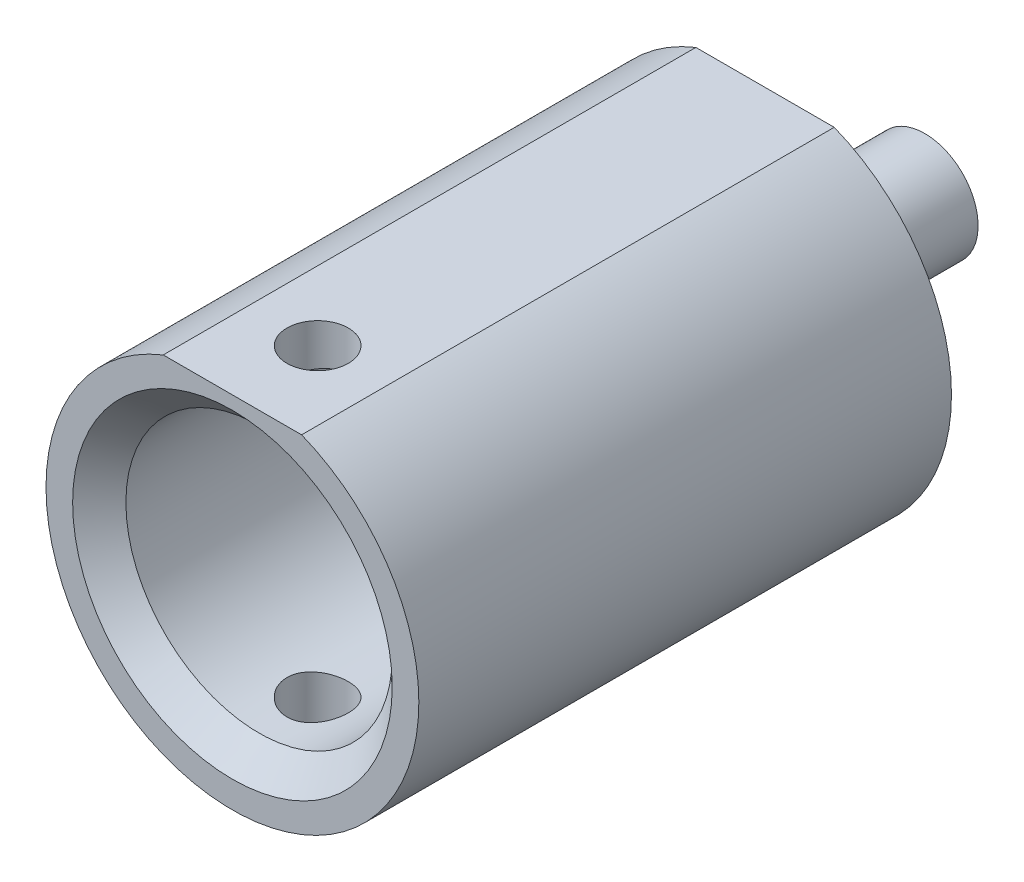
ISO-10303-21;
HEADER;
FILE_DESCRIPTION(('STEP AP214'),'2;1');
FILE_NAME('part.step','',(''),(''),'','','');
FILE_SCHEMA(('AUTOMOTIVE_DESIGN { 1 0 10303 214 1 1 1 1 }'));
ENDSEC;
DATA;
#1=APPLICATION_CONTEXT('core data for automotive mechanical design processes');
#2=APPLICATION_PROTOCOL_DEFINITION('international standard','automotive_design',2000,#1);
#3=PRODUCT_CONTEXT('',#1,'mechanical');
#4=PRODUCT('Part','Part','',(#3));
#5=PRODUCT_RELATED_PRODUCT_CATEGORY('part','',(#4));
#6=PRODUCT_DEFINITION_FORMATION('','',#4);
#7=PRODUCT_DEFINITION_CONTEXT('part definition',#1,'design');
#8=PRODUCT_DEFINITION('design','',#6,#7);
#9=PRODUCT_DEFINITION_SHAPE('','',#8);
#10=(LENGTH_UNIT() NAMED_UNIT(*) SI_UNIT(.MILLI.,.METRE.));
#11=(NAMED_UNIT(*) PLANE_ANGLE_UNIT() SI_UNIT($,.RADIAN.));
#12=(NAMED_UNIT(*) SI_UNIT($,.STERADIAN.) SOLID_ANGLE_UNIT());
#13=UNCERTAINTY_MEASURE_WITH_UNIT(LENGTH_MEASURE(1.E-05),#10,'distance_accuracy_value','');
#14=(GEOMETRIC_REPRESENTATION_CONTEXT(3) GLOBAL_UNCERTAINTY_ASSIGNED_CONTEXT((#13)) GLOBAL_UNIT_ASSIGNED_CONTEXT((#10,
#11,#12)) REPRESENTATION_CONTEXT('',''));
#15=CARTESIAN_POINT('',(0.,0.,0.));
#16=DIRECTION('',(0.,0.,1.));
#17=DIRECTION('',(1.,0.,0.));
#18=AXIS2_PLACEMENT_3D('',#15,#16,#17);
#19=CARTESIAN_POINT('',(-11.1125,10.31875,-31.75));
#20=DIRECTION('',(0.,-1.,0.));
#21=DIRECTION('',(0.,0.,-1.));
#22=AXIS2_PLACEMENT_3D('',#19,#20,#21);
#23=PLANE('',#22);
#24=DIRECTION('',(1.,0.,0.));
#25=VECTOR('',#24,1.);
#26=CARTESIAN_POINT('',(-11.1125,10.31875,0.));
#27=LINE('',#26,#25);
#28=CARTESIAN_POINT('',(-4.12444598552339,10.31875,0.));
#29=VERTEX_POINT('',#28);
#30=CARTESIAN_POINT('',(4.12444598552339,10.31875,0.));
#31=VERTEX_POINT('',#30);
#32=EDGE_CURVE('E167',#29,#31,#27,.T.);
#33=ORIENTED_EDGE('',*,*,#32,.T.);
#34=DIRECTION('',(0.,0.,-1.));
#35=VECTOR('',#34,1.);
#36=CARTESIAN_POINT('',(4.12444598552338,10.31875,-25.4));
#37=LINE('',#36,#35);
#38=CARTESIAN_POINT('',(4.12444598552338,10.31875,-31.75));
#39=VERTEX_POINT('',#38);
#40=EDGE_CURVE('E57',#39,#31,#37,.F.);
#41=ORIENTED_EDGE('',*,*,#40,.F.);
#42=DIRECTION('',(1.,0.,0.));
#43=VECTOR('',#42,1.);
#44=CARTESIAN_POINT('',(11.1125,10.31875,-31.75));
#45=LINE('',#44,#43);
#46=CARTESIAN_POINT('',(-4.12444598552339,10.31875,-31.75));
#47=VERTEX_POINT('',#46);
#48=EDGE_CURVE('E68',#47,#39,#45,.T.);
#49=ORIENTED_EDGE('',*,*,#48,.F.);
#50=DIRECTION('',(0.,0.,-1.));
#51=VECTOR('',#50,1.);
#52=CARTESIAN_POINT('',(-4.12444598552339,10.31875,-25.4));
#53=LINE('',#52,#51);
#54=EDGE_CURVE('E71',#29,#47,#53,.T.);
#55=ORIENTED_EDGE('',*,*,#54,.F.);
#56=EDGE_LOOP('',(#33,#41,#49,#55));
#57=FACE_BOUND('',#56,.T.);
#58=CARTESIAN_POINT('',(0.,10.31875,-5.08));
#59=DIRECTION('',(0.,1.,0.));
#60=DIRECTION('',(0.,0.,1.));
#61=AXIS2_PLACEMENT_3D('',#58,#59,#60);
#62=CIRCLE('',#61,1.8288);
#63=CARTESIAN_POINT('',(0.,10.31875,-3.2512));
#64=VERTEX_POINT('',#63);
#65=EDGE_CURVE('E129',#64,#64,#62,.T.);
#66=ORIENTED_EDGE('',*,*,#65,.F.);
#67=EDGE_LOOP('',(#66));
#68=FACE_BOUND('',#67,.T.);
#69=ADVANCED_FACE('F40',(#57,#68),#23,.F.);
#70=CARTESIAN_POINT('',(7.9375,0.,0.));
#71=DIRECTION('',(0.,0.,-1.));
#72=DIRECTION('',(-1.,0.,0.));
#73=AXIS2_PLACEMENT_3D('',#70,#71,#72);
#74=PLANE('',#73);
#75=CARTESIAN_POINT('',(0.,0.,0.));
#76=DIRECTION('',(0.,0.,-1.));
#77=DIRECTION('',(-1.,0.,0.));
#78=AXIS2_PLACEMENT_3D('',#75,#76,#77);
#79=CIRCLE('',#78,9.52500000000001);
#80=CARTESIAN_POINT('',(-9.52500000000001,0.,0.));
#81=VERTEX_POINT('',#80);
#82=EDGE_CURVE('E11',#81,#81,#79,.T.);
#83=ORIENTED_EDGE('',*,*,#82,.T.);
#84=EDGE_LOOP('',(#83));
#85=FACE_BOUND('',#84,.T.);
#86=CARTESIAN_POINT('',(0.,0.,0.));
#87=DIRECTION('',(0.,0.,-1.));
#88=DIRECTION('',(-1.,0.,0.));
#89=AXIS2_PLACEMENT_3D('',#86,#87,#88);
#90=CIRCLE('',#89,11.1125);
#91=EDGE_CURVE('E78',#31,#29,#90,.T.);
#92=ORIENTED_EDGE('',*,*,#91,.F.);
#93=ORIENTED_EDGE('',*,*,#32,.F.);
#94=EDGE_LOOP('',(#92,#93));
#95=FACE_BOUND('',#94,.T.);
#96=ADVANCED_FACE('F154',(#85,#95),#74,.F.);
#97=CARTESIAN_POINT('',(0.,0.,-25.4));
#98=DIRECTION('',(0.,0.,-1.));
#99=DIRECTION('',(-1.,0.,0.));
#100=AXIS2_PLACEMENT_3D('',#97,#98,#99);
#101=CYLINDRICAL_SURFACE('',#100,11.1125);
#102=CARTESIAN_POINT('',(0.,-11.1125,-3.2512));
#103=CARTESIAN_POINT('',(0.101985960535653,-11.1124982653038,-3.25120410548556));
#104=CARTESIAN_POINT('',(0.204028043247026,-11.1110813861697,-3.25975993185678));
#105=CARTESIAN_POINT('',(0.405251523738962,-11.1055656033744,-3.29374368015818));
#106=CARTESIAN_POINT('',(0.504430181648661,-11.1014642144057,-3.31918723698266));
#107=CARTESIAN_POINT('',(0.69698629945415,-11.0910395524147,-3.38615848071108));
#108=CARTESIAN_POINT('',(0.790368386776859,-11.0847180792523,-3.42767314127914));
#109=CARTESIAN_POINT('',(0.968829151098192,-11.0705487668123,-3.525574329719));
#110=CARTESIAN_POINT('',(1.05390880270725,-11.062701107016,-3.58195910912582));
#111=CARTESIAN_POINT('',(1.21415570768047,-11.046267864757,-3.70855977981771));
#112=CARTESIAN_POINT('',(1.2892342504777,-11.0376766672591,-3.7788872410582));
#113=CARTESIAN_POINT('',(1.42658156525565,-11.020767735379,-3.93113679679186));
#114=CARTESIAN_POINT('',(1.48884953833928,-11.012450018079,-4.01305961386112));
#115=CARTESIAN_POINT('',(1.59916234075337,-10.9969754147448,-4.18678203635041));
#116=CARTESIAN_POINT('',(1.64711969481333,-10.989825784274,-4.27863789075198));
#117=CARTESIAN_POINT('',(1.72689058351035,-10.9775746002825,-4.46923874282233));
#118=CARTESIAN_POINT('',(1.75870518068841,-10.9724729119676,-4.56798328658024));
#119=CARTESIAN_POINT('',(1.80500847544525,-10.9649510462,-4.76861911753284));
#120=CARTESIAN_POINT('',(1.8196501607605,-10.9625072053294,-4.87047419395057));
#121=CARTESIAN_POINT('',(1.83166629505133,-10.960506117847,-5.07522251696541));
#122=CARTESIAN_POINT('',(1.82904193558186,-10.9609486720408,-5.17811569143255));
#123=CARTESIAN_POINT('',(1.80672514342344,-10.9646487623503,-5.38092883999761));
#124=CARTESIAN_POINT('',(1.78720437748207,-10.9678779850454,-5.48086829528332));
#125=CARTESIAN_POINT('',(1.73191821058887,-10.9767432517669,-5.67603389159448));
#126=CARTESIAN_POINT('',(1.69615226520577,-10.9823793764565,-5.77125987453679));
#127=CARTESIAN_POINT('',(1.60921636854674,-10.995454073291,-5.95481042632173));
#128=CARTESIAN_POINT('',(1.55797494509279,-11.0029009765789,-6.04310052563737));
#129=CARTESIAN_POINT('',(1.44159341321552,-11.0187523371249,-6.20989432005747));
#130=CARTESIAN_POINT('',(1.37645221043961,-11.0271568697544,-6.28839724382999));
#131=CARTESIAN_POINT('',(1.23318399862092,-11.0441010081602,-6.43438212626586));
#132=CARTESIAN_POINT('',(1.15490966156367,-11.0526410193835,-6.50171953530278));
#133=CARTESIAN_POINT('',(0.988095880112558,-11.068799988199,-6.62232584362568));
#134=CARTESIAN_POINT('',(0.899556372612236,-11.0764189401284,-6.67559465641654));
#135=CARTESIAN_POINT('',(0.714591042791295,-11.0898877687047,-6.76656406709567));
#136=CARTESIAN_POINT('',(0.618158934188807,-11.0957362174189,-6.80425210780656));
#137=CARTESIAN_POINT('',(0.420216068834705,-11.1049935533848,-6.86285711681494));
#138=CARTESIAN_POINT('',(0.318705726912424,-11.1084026395554,-6.8837754526226));
#139=CARTESIAN_POINT('',(0.114734004545082,-11.1123704433878,-6.90805179365634));
#140=CARTESIAN_POINT('',(0.0122968508158143,-11.1129613754213,-6.91160827374304));
#141=CARTESIAN_POINT('',(-0.191709829817353,-11.1113144504187,-6.90158878404296));
#142=CARTESIAN_POINT('',(-0.293279389098974,-11.1090766994144,-6.88801345643453));
#143=CARTESIAN_POINT('',(-0.492056200577945,-11.102043787206,-6.84428078060995));
#144=CARTESIAN_POINT('',(-0.589285607361028,-11.0972637539347,-6.81422148821793));
#145=CARTESIAN_POINT('',(-0.777324902870263,-11.0856801606181,-6.73847853882407));
#146=CARTESIAN_POINT('',(-0.868134438285147,-11.078876489311,-6.69279402270996));
#147=CARTESIAN_POINT('',(-1.04161974352678,-11.0639206396394,-6.58664142170487));
#148=CARTESIAN_POINT('',(-1.12421852036903,-11.0557573258866,-6.52604910602645));
#149=CARTESIAN_POINT('',(-1.27814635489314,-11.0390218767154,-6.39197206254774));
#150=CARTESIAN_POINT('',(-1.34947461501104,-11.0304497124204,-6.31848642312058));
#151=CARTESIAN_POINT('',(-1.47957060227745,-11.0137587973787,-6.15981941384805));
#152=CARTESIAN_POINT('',(-1.53820436630089,-11.0056454927491,-6.0745275406457));
#153=CARTESIAN_POINT('',(-1.64031195080058,-10.9908919400377,-5.89518839893954));
#154=CARTESIAN_POINT('',(-1.68378624303428,-10.9842516461185,-5.80114140300751));
#155=CARTESIAN_POINT('',(-1.7541394962161,-10.9732366337449,-5.60733949652736));
#156=CARTESIAN_POINT('',(-1.78108563681604,-10.9688527558105,-5.50760951733691));
#157=CARTESIAN_POINT('',(-1.8178294169093,-10.9628237752277,-5.30496093587188));
#158=CARTESIAN_POINT('',(-1.82762850642928,-10.9611784409971,-5.20204260396694));
#159=CARTESIAN_POINT('',(-1.82976036186447,-10.9608226469247,-4.99727617260834));
#160=CARTESIAN_POINT('',(-1.82230396017862,-10.9620767606391,-4.89543026813602));
#161=CARTESIAN_POINT('',(-1.79059184583152,-10.9673009987978,-4.69446302701059));
#162=CARTESIAN_POINT('',(-1.76633618374101,-10.9712711150662,-4.59534168215667));
#163=CARTESIAN_POINT('',(-1.70179404198128,-10.9814667041126,-4.40271576019903));
#164=CARTESIAN_POINT('',(-1.66152526851135,-10.9876896851486,-4.30920511017189));
#165=CARTESIAN_POINT('',(-1.56612154810081,-11.0016923216277,-4.13023283417337));
#166=CARTESIAN_POINT('',(-1.51098589411298,-11.0094720511029,-4.04477159128099));
#167=CARTESIAN_POINT('',(-1.38665928330937,-11.0258241278221,-3.88325807729798));
#168=CARTESIAN_POINT('',(-1.31731307785735,-11.0344046046771,-3.80732611674653));
#169=CARTESIAN_POINT('',(-1.16686135502921,-11.0513261367212,-3.66810405791292));
#170=CARTESIAN_POINT('',(-1.08575312548285,-11.0596671361572,-3.60481688337937));
#171=CARTESIAN_POINT('',(-0.913432962190398,-11.0752347211619,-3.49229342623428));
#172=CARTESIAN_POINT('',(-0.822156822293083,-11.0824534450163,-3.44315437723751));
#173=CARTESIAN_POINT('',(-0.632564875730705,-11.0948865635832,-3.36098171401747));
#174=CARTESIAN_POINT('',(-0.534256230784516,-11.1001029638852,-3.32793197529191));
#175=CARTESIAN_POINT('',(-0.362964683690035,-11.1067984499267,-3.28609228113667));
#176=CARTESIAN_POINT('',(-0.291020897467136,-11.108925161963,-3.27302850448139));
#177=CARTESIAN_POINT('',(-0.146060992144094,-11.1117765466226,-3.25558096546249));
#178=CARTESIAN_POINT('',(-0.0730448907983154,-11.1125012424327,-3.25119705954876));
#179=CARTESIAN_POINT('',(0.,-11.1125,-3.2512));
#180=B_SPLINE_CURVE_WITH_KNOTS('',3,(#102,#103,#104,#105,#106,#107,#108,#109,#110,#111,#112,
#113,#114,#115,#116,#117,#118,#119,#120,#121,#122,#123,#124,#125,#126,#127,#128,#129,#130,#131,
#132,#133,#134,#135,#136,#137,#138,#139,#140,#141,#142,#143,#144,#145,#146,#147,#148,#149,#150,
#151,#152,#153,#154,#155,#156,#157,#158,#159,#160,#161,#162,#163,#164,#165,#166,#167,#168,#169,
#170,#171,#172,#173,#174,#175,#176,#177,#178,#179),.UNSPECIFIED.,.T.,.F.,(4,2,2,2,2,2,2,2,2,2,2,
2,2,2,2,2,2,2,2,2,2,2,2,2,2,2,2,2,2,2,2,2,2,2,2,2,2,2,4),(0.,0.305690892734799,
0.611665193824152,0.917392006819801,1.22308288772342,1.53132655924921,1.83958944774879,
2.14969974648115,2.45978963062957,2.7670955239289,3.07438020982243,3.37857906193167,
3.6827881095324,3.98842418225694,4.29408432709893,4.60343591699062,4.91278940876195,
5.22239173731312,5.53196881631981,5.83799849160388,6.14401669583946,6.44823397425175,
6.75246798194876,7.05932863847077,7.36621100043049,7.67618905032028,7.98615745294054,
8.29485747421136,8.60353138925,8.90845378507457,9.21337526299625,9.51796051304439,
9.82256025128012,10.1306844351916,10.4388797818527,10.7491452430969,11.05909911682,
11.2780461861578,11.4969896344577),.UNSPECIFIED.);
#181=CARTESIAN_POINT('',(0.,-11.1125,-3.2512));
#182=VERTEX_POINT('',#181);
#183=EDGE_CURVE('E77',#182,#182,#180,.T.);
#184=ORIENTED_EDGE('',*,*,#183,.T.);
#185=EDGE_LOOP('',(#184));
#186=FACE_BOUND('',#185,.T.);
#187=ORIENTED_EDGE('',*,*,#91,.T.);
#188=ORIENTED_EDGE('',*,*,#54,.T.);
#189=CARTESIAN_POINT('',(0.,0.,-31.75));
#190=DIRECTION('',(0.,0.,-1.));
#191=DIRECTION('',(-1.,0.,0.));
#192=AXIS2_PLACEMENT_3D('',#189,#190,#191);
#193=CIRCLE('',#192,11.1125);
#194=EDGE_CURVE('E83',#39,#47,#193,.T.);
#195=ORIENTED_EDGE('',*,*,#194,.F.);
#196=ORIENTED_EDGE('',*,*,#40,.T.);
#197=EDGE_LOOP('',(#187,#188,#195,#196));
#198=FACE_BOUND('',#197,.T.);
#199=ADVANCED_FACE('F82',(#186,#198),#101,.T.);
#200=CARTESIAN_POINT('',(11.1125,0.,-31.75));
#201=DIRECTION('',(0.,0.,1.));
#202=DIRECTION('',(1.,0.,0.));
#203=AXIS2_PLACEMENT_3D('',#200,#201,#202);
#204=PLANE('',#203);
#205=CARTESIAN_POINT('',(0.,0.,-31.75));
#206=DIRECTION('',(0.,0.,-1.));
#207=DIRECTION('',(-1.,0.,0.));
#208=AXIS2_PLACEMENT_3D('',#205,#206,#207);
#209=CIRCLE('',#208,3.175);
#210=CARTESIAN_POINT('',(-3.175,0.,-31.75));
#211=VERTEX_POINT('',#210);
#212=EDGE_CURVE('E90',#211,#211,#209,.T.);
#213=ORIENTED_EDGE('',*,*,#212,.F.);
#214=EDGE_LOOP('',(#213));
#215=FACE_BOUND('',#214,.T.);
#216=ORIENTED_EDGE('',*,*,#194,.T.);
#217=ORIENTED_EDGE('',*,*,#48,.T.);
#218=EDGE_LOOP('',(#216,#217));
#219=FACE_BOUND('',#218,.T.);
#220=ADVANCED_FACE('F88',(#215,#219),#204,.F.);
#221=CARTESIAN_POINT('',(0.,0.,-25.4));
#222=DIRECTION('',(0.,0.,-1.));
#223=DIRECTION('',(-1.,0.,0.));
#224=AXIS2_PLACEMENT_3D('',#221,#222,#223);
#225=CYLINDRICAL_SURFACE('',#224,3.175);
#226=CARTESIAN_POINT('',(0.,0.,-41.275));
#227=DIRECTION('',(0.,0.,-1.));
#228=DIRECTION('',(-1.,0.,0.));
#229=AXIS2_PLACEMENT_3D('',#226,#227,#228);
#230=CIRCLE('',#229,3.175);
#231=CARTESIAN_POINT('',(-3.175,0.,-41.275));
#232=VERTEX_POINT('',#231);
#233=EDGE_CURVE('E96',#232,#232,#230,.T.);
#234=ORIENTED_EDGE('',*,*,#233,.F.);
#235=EDGE_LOOP('',(#234));
#236=FACE_BOUND('',#235,.T.);
#237=ORIENTED_EDGE('',*,*,#212,.T.);
#238=EDGE_LOOP('',(#237));
#239=FACE_BOUND('',#238,.T.);
#240=ADVANCED_FACE('F145',(#236,#239),#225,.T.);
#241=CARTESIAN_POINT('',(3.175,0.,-41.275));
#242=DIRECTION('',(0.,0.,1.));
#243=DIRECTION('',(1.,0.,0.));
#244=AXIS2_PLACEMENT_3D('',#241,#242,#243);
#245=PLANE('',#244);
#246=ORIENTED_EDGE('',*,*,#233,.T.);
#247=EDGE_LOOP('',(#246));
#248=FACE_BOUND('',#247,.T.);
#249=ADVANCED_FACE('F142',(#248),#245,.F.);
#250=CARTESIAN_POINT('',(0.,0.,-25.4));
#251=DIRECTION('',(0.,0.,1.));
#252=DIRECTION('',(1.,0.,0.));
#253=AXIS2_PLACEMENT_3D('',#250,#251,#252);
#254=CONICAL_SURFACE('',#253,7.9375,1.02974425867665);
#255=CARTESIAN_POINT('',(0.,0.,-30.1693311635313));
#256=VERTEX_POINT('',#255);
#257=VERTEX_LOOP('',#256);
#258=FACE_BOUND('',#257,.T.);
#259=CARTESIAN_POINT('',(0.,0.,-25.4));
#260=DIRECTION('',(0.,0.,1.));
#261=DIRECTION('',(1.,0.,0.));
#262=AXIS2_PLACEMENT_3D('',#259,#260,#261);
#263=CIRCLE('',#262,7.9375);
#264=CARTESIAN_POINT('',(7.9375,0.,-25.4));
#265=VERTEX_POINT('',#264);
#266=EDGE_CURVE('E86',#265,#265,#263,.T.);
#267=ORIENTED_EDGE('',*,*,#266,.T.);
#268=EDGE_LOOP('',(#267));
#269=FACE_BOUND('',#268,.T.);
#270=ADVANCED_FACE('F137',(#258,#269),#254,.F.);
#271=CARTESIAN_POINT('',(0.,0.,0.));
#272=DIRECTION('',(0.,0.,1.));
#273=DIRECTION('',(1.,0.,0.));
#274=AXIS2_PLACEMENT_3D('',#271,#272,#273);
#275=CYLINDRICAL_SURFACE('',#274,7.9375);
#276=CARTESIAN_POINT('',(0.,0.,-1.58750000000001));
#277=DIRECTION('',(0.,0.,-1.));
#278=DIRECTION('',(-1.,0.,0.));
#279=AXIS2_PLACEMENT_3D('',#276,#277,#278);
#280=CIRCLE('',#279,7.9375);
#281=CARTESIAN_POINT('',(-7.9375,0.,-1.58750000000001));
#282=VERTEX_POINT('',#281);
#283=EDGE_CURVE('E50',#282,#282,#280,.F.);
#284=ORIENTED_EDGE('',*,*,#283,.T.);
#285=EDGE_LOOP('',(#284));
#286=FACE_BOUND('',#285,.T.);
#287=CARTESIAN_POINT('',(0.,-7.9375,-3.2512));
#288=CARTESIAN_POINT('',(-0.101290977462428,-7.93749816393532,-3.25120325665354));
#289=CARTESIAN_POINT('',(-0.202620182864448,-7.93554156190011,-3.25964362337697));
#290=CARTESIAN_POINT('',(-0.402391050629751,-7.92792547515311,-3.29314149773531));
#291=CARTESIAN_POINT('',(-0.500830758017521,-7.92226354119656,-3.31820999680595));
#292=CARTESIAN_POINT('',(-0.691907476541537,-7.90786597516002,-3.38412991607668));
#293=CARTESIAN_POINT('',(-0.784550748149965,-7.89913372913068,-3.42496395431836));
#294=CARTESIAN_POINT('',(-0.961669654036117,-7.87953349301834,-3.52119845380222));
#295=CARTESIAN_POINT('',(-1.04614532144994,-7.86866551160059,-3.57659885594505));
#296=CARTESIAN_POINT('',(-1.20602744550795,-7.84576558595723,-3.70142992326733));
#297=CARTESIAN_POINT('',(-1.28126875862167,-7.83371791104395,-3.77106923242966));
#298=CARTESIAN_POINT('',(-1.41911315995188,-7.80992496712857,-3.92195382116297));
#299=CARTESIAN_POINT('',(-1.48171501976054,-7.79817972761636,-4.00320022749975));
#300=CARTESIAN_POINT('',(-1.59324925973941,-7.77616521683032,-4.17623571527409));
#301=CARTESIAN_POINT('',(-1.64200263480956,-7.76591603933425,-4.26814296501911));
#302=CARTESIAN_POINT('',(-1.72330672299244,-7.74828126314159,-4.4591216486345));
#303=CARTESIAN_POINT('',(-1.75585960353164,-7.74089528141394,-4.55819212212156));
#304=CARTESIAN_POINT('',(-1.80328651932051,-7.7299839389101,-4.75888449026449));
#305=CARTESIAN_POINT('',(-1.81845461688856,-7.72639444402163,-4.86043332938175));
#306=CARTESIAN_POINT('',(-1.83159635121299,-7.72329011507285,-5.06469289375464));
#307=CARTESIAN_POINT('',(-1.8295723429179,-7.72377472294804,-5.16740345795412));
#308=CARTESIAN_POINT('',(-1.80862323381076,-7.72870592769576,-5.36886096527859));
#309=CARTESIAN_POINT('',(-1.79004283540181,-7.73307171452374,-5.46764603426656));
#310=CARTESIAN_POINT('',(-1.73705583529585,-7.74514523660411,-5.66065801271483));
#311=CARTESIAN_POINT('',(-1.70264825902006,-7.75285317765226,-5.75488464108836));
#312=CARTESIAN_POINT('',(-1.61867535552935,-7.77082017686724,-5.9370579142669));
#313=CARTESIAN_POINT('',(-1.56898017437041,-7.78110094358972,-6.02494247235641));
#314=CARTESIAN_POINT('',(-1.45593384238535,-7.80304228575033,-6.19125132983975));
#315=CARTESIAN_POINT('',(-1.39258063841423,-7.81470306852065,-6.2696742041367));
#316=CARTESIAN_POINT('',(-1.25220595401443,-7.83843499384479,-6.41681494248817));
#317=CARTESIAN_POINT('',(-1.17489213196007,-7.85050925718724,-6.48525370694722));
#318=CARTESIAN_POINT('',(-1.00974464967736,-7.87345293858794,-6.60824248229878));
#319=CARTESIAN_POINT('',(-0.921910756207134,-7.88432232992253,-6.66279218517125));
#320=CARTESIAN_POINT('',(-0.737855190155772,-7.90367317309104,-6.75653517199862));
#321=CARTESIAN_POINT('',(-0.641612604364459,-7.91214843560259,-6.79568875426386));
#322=CARTESIAN_POINT('',(-0.443674646057923,-7.92571052923285,-6.85718818965956));
#323=CARTESIAN_POINT('',(-0.341980158387592,-7.93079790841766,-6.87953676145294));
#324=CARTESIAN_POINT('',(-0.138416331452297,-7.93693190047847,-6.90637858572669));
#325=CARTESIAN_POINT('',(-0.036599733022636,-7.93806467982979,-6.91125265347401));
#326=CARTESIAN_POINT('',(0.16639317434014,-7.93640471800712,-6.90404369878175));
#327=CARTESIAN_POINT('',(0.267569531154074,-7.93361227395313,-6.89196195981299));
#328=CARTESIAN_POINT('',(0.465126077804733,-7.92447031608811,-6.85149955109419));
#329=CARTESIAN_POINT('',(0.561549997177168,-7.91816504536164,-6.82332150030438));
#330=CARTESIAN_POINT('',(0.748301063382379,-7.9027045641847,-6.75169357427684));
#331=CARTESIAN_POINT('',(0.838627652452329,-7.89354909343646,-6.7082423041481));
#332=CARTESIAN_POINT('',(1.01217349687657,-7.8731931885074,-6.60652793993202));
#333=CARTESIAN_POINT('',(1.09526026507343,-7.86196314643553,-6.54804485635165));
#334=CARTESIAN_POINT('',(1.25057679460296,-7.83875892278081,-6.41821355125619));
#335=CARTESIAN_POINT('',(1.32280497741412,-7.82678463336303,-6.34686346256361));
#336=CARTESIAN_POINT('',(1.45588288901799,-7.80313926459568,-6.19156790310574));
#337=CARTESIAN_POINT('',(1.51646757946207,-7.7914795123082,-6.10739325134871));
#338=CARTESIAN_POINT('',(1.62264458574821,-7.7700628219452,-5.92984210267427));
#339=CARTESIAN_POINT('',(1.66823756790198,-7.76030579931004,-5.8364660149577));
#340=CARTESIAN_POINT('',(1.74281422716208,-7.7438984880837,-5.64367178361408));
#341=CARTESIAN_POINT('',(1.77189436311005,-7.73723019990395,-5.54429256122472));
#342=CARTESIAN_POINT('',(1.81289397261352,-7.72772753122434,-5.34188258954134));
#343=CARTESIAN_POINT('',(1.82481654157395,-7.72489245917767,-5.23885250233906));
#344=CARTESIAN_POINT('',(1.83101979320087,-7.72342414196153,-5.0347461110453));
#345=CARTESIAN_POINT('',(1.8257218170528,-7.72469054186512,-4.93368311165719));
#346=CARTESIAN_POINT('',(1.79858433041086,-7.73105369711141,-4.73393217140342));
#347=CARTESIAN_POINT('',(1.77674506088146,-7.7361503966564,-4.63524419596132));
#348=CARTESIAN_POINT('',(1.71735835936836,-7.74954837298985,-4.44342365665856));
#349=CARTESIAN_POINT('',(1.67987862330863,-7.75783582755608,-4.3502691042019));
#350=CARTESIAN_POINT('',(1.59033084575692,-7.7766855695413,-4.17150997384206));
#351=CARTESIAN_POINT('',(1.53826109670361,-7.78724812319601,-4.08590628120647));
#352=CARTESIAN_POINT('',(1.41964144784188,-7.80975283420994,-3.92261625997186));
#353=CARTESIAN_POINT('',(1.35279405458157,-7.82172053992703,-3.84514952184086));
#354=CARTESIAN_POINT('',(1.20711143596787,-7.84552264049661,-3.70239537996744));
#355=CARTESIAN_POINT('',(1.12827342257784,-7.85735700365536,-3.63711081668393));
#356=CARTESIAN_POINT('',(0.959445415613636,-7.87976650617285,-3.51964592176694));
#357=CARTESIAN_POINT('',(0.869308135891197,-7.89032050699004,-3.46767299015724));
#358=CARTESIAN_POINT('',(0.681348169477215,-7.90876459559702,-3.37969923035652));
#359=CARTESIAN_POINT('',(0.583531671311998,-7.91665680185044,-3.34368569323385));
#360=CARTESIAN_POINT('',(0.404757036178968,-7.92756521673287,-3.29469210077328));
#361=CARTESIAN_POINT('',(0.324727846087336,-7.93126680377621,-3.27841511498998));
#362=CARTESIAN_POINT('',(0.163140648350698,-7.9362348688986,-3.25666804565731));
#363=CARTESIAN_POINT('',(0.081582723721013,-7.93750147882033,-3.25119737699573));
#364=CARTESIAN_POINT('',(0.,-7.9375,-3.2512));
#365=B_SPLINE_CURVE_WITH_KNOTS('',3,(#287,#288,#289,#290,#291,#292,#293,#294,#295,#296,#297,
#298,#299,#300,#301,#302,#303,#304,#305,#306,#307,#308,#309,#310,#311,#312,#313,#314,#315,#316,
#317,#318,#319,#320,#321,#322,#323,#324,#325,#326,#327,#328,#329,#330,#331,#332,#333,#334,#335,
#336,#337,#338,#339,#340,#341,#342,#343,#344,#345,#346,#347,#348,#349,#350,#351,#352,#353,#354,
#355,#356,#357,#358,#359,#360,#361,#362,#363,#364),.UNSPECIFIED.,.T.,.F.,(4,2,2,2,2,2,2,2,2,2,2,
2,2,2,2,2,2,2,2,2,2,2,2,2,2,2,2,2,2,2,2,2,2,2,2,2,2,2,4),(0.,0.303574186336809,
0.607349239836714,0.910790324670725,1.2142301783877,1.52248405698823,1.83076787987446,
2.14287194906064,2.4549342513366,2.76163630658585,3.06829635093175,3.3687171817989,
3.66915651394091,3.97222175835309,4.275332592915,4.58574075639735,4.89615580325388,
5.20736614316143,5.51852612557895,5.82286244151111,6.12717572192965,6.42774018658749,
6.72833210869477,7.03360208207678,7.33891638998381,7.65051999065141,7.96210974011539,
8.27186012061219,8.5815546118848,8.8837292715113,9.18589952930788,9.48677526410541,
9.78768622700842,10.0953193829923,10.4030241789297,10.7152657603037,11.0272582458075,
11.271779038176,11.516286590509),.UNSPECIFIED.);
#366=CARTESIAN_POINT('',(0.,-7.9375,-3.2512));
#367=VERTEX_POINT('',#366);
#368=EDGE_CURVE('E128',#367,#367,#365,.T.);
#369=ORIENTED_EDGE('',*,*,#368,.T.);
#370=EDGE_LOOP('',(#369));
#371=FACE_BOUND('',#370,.T.);
#372=CARTESIAN_POINT('',(0.,7.9375,-3.2512));
#373=CARTESIAN_POINT('',(0.101290977462428,7.93749816393532,-3.25120325665354));
#374=CARTESIAN_POINT('',(0.202620182864448,7.93554156190011,-3.25964362337697));
#375=CARTESIAN_POINT('',(0.402391050629751,7.92792547515311,-3.29314149773531));
#376=CARTESIAN_POINT('',(0.500830758017521,7.92226354119656,-3.31820999680594));
#377=CARTESIAN_POINT('',(0.691907476541537,7.90786597516002,-3.38412991607668));
#378=CARTESIAN_POINT('',(0.784550748149965,7.89913372913068,-3.42496395431835));
#379=CARTESIAN_POINT('',(0.961669654036117,7.87953349301834,-3.52119845380222));
#380=CARTESIAN_POINT('',(1.04614532144994,7.86866551160059,-3.57659885594504));
#381=CARTESIAN_POINT('',(1.20602744550795,7.84576558595723,-3.70142992326733));
#382=CARTESIAN_POINT('',(1.28126875862167,7.83371791104395,-3.77106923242966));
#383=CARTESIAN_POINT('',(1.41911315995188,7.80992496712857,-3.92195382116297));
#384=CARTESIAN_POINT('',(1.48171501976054,7.79817972761636,-4.00320022749975));
#385=CARTESIAN_POINT('',(1.59324925973941,7.77616521683032,-4.17623571527409));
#386=CARTESIAN_POINT('',(1.64200263480956,7.76591603933425,-4.26814296501911));
#387=CARTESIAN_POINT('',(1.72330672299244,7.74828126314159,-4.4591216486345));
#388=CARTESIAN_POINT('',(1.75585960353164,7.74089528141394,-4.55819212212156));
#389=CARTESIAN_POINT('',(1.80328651932051,7.7299839389101,-4.75888449026449));
#390=CARTESIAN_POINT('',(1.81845461688856,7.72639444402163,-4.86043332938175));
#391=CARTESIAN_POINT('',(1.83159635121299,7.72329011507285,-5.06469289375464));
#392=CARTESIAN_POINT('',(1.8295723429179,7.72377472294804,-5.16740345795412));
#393=CARTESIAN_POINT('',(1.80862323381076,7.72870592769576,-5.36886096527859));
#394=CARTESIAN_POINT('',(1.79004283540181,7.73307171452374,-5.46764603426656));
#395=CARTESIAN_POINT('',(1.73705583529585,7.74514523660411,-5.66065801271482));
#396=CARTESIAN_POINT('',(1.70264825902006,7.75285317765226,-5.75488464108836));
#397=CARTESIAN_POINT('',(1.61867535552935,7.77082017686724,-5.9370579142669));
#398=CARTESIAN_POINT('',(1.56898017437041,7.78110094358972,-6.02494247235641));
#399=CARTESIAN_POINT('',(1.45593384238535,7.80304228575033,-6.19125132983975));
#400=CARTESIAN_POINT('',(1.39258063841423,7.81470306852065,-6.2696742041367));
#401=CARTESIAN_POINT('',(1.25220595401443,7.83843499384479,-6.41681494248817));
#402=CARTESIAN_POINT('',(1.17489213196007,7.85050925718724,-6.48525370694722));
#403=CARTESIAN_POINT('',(1.00974464967736,7.87345293858794,-6.60824248229878));
#404=CARTESIAN_POINT('',(0.921910756207134,7.88432232992254,-6.66279218517125));
#405=CARTESIAN_POINT('',(0.737855190155772,7.90367317309104,-6.75653517199861));
#406=CARTESIAN_POINT('',(0.641612604364458,7.91214843560259,-6.79568875426386));
#407=CARTESIAN_POINT('',(0.443674646057922,7.92571052923285,-6.85718818965956));
#408=CARTESIAN_POINT('',(0.341980158387591,7.93079790841766,-6.87953676145294));
#409=CARTESIAN_POINT('',(0.138416331452296,7.93693190047847,-6.90637858572668));
#410=CARTESIAN_POINT('',(0.0365997330226353,7.93806467982979,-6.91125265347401));
#411=CARTESIAN_POINT('',(-0.166393174340141,7.93640471800712,-6.90404369878175));
#412=CARTESIAN_POINT('',(-0.267569531154074,7.93361227395313,-6.89196195981299));
#413=CARTESIAN_POINT('',(-0.465126077804734,7.92447031608811,-6.85149955109418));
#414=CARTESIAN_POINT('',(-0.561549997177168,7.91816504536164,-6.82332150030438));
#415=CARTESIAN_POINT('',(-0.748301063382379,7.9027045641847,-6.75169357427684));
#416=CARTESIAN_POINT('',(-0.838627652452329,7.89354909343646,-6.7082423041481));
#417=CARTESIAN_POINT('',(-1.01217349687657,7.8731931885074,-6.60652793993202));
#418=CARTESIAN_POINT('',(-1.09526026507343,7.86196314643553,-6.54804485635165));
#419=CARTESIAN_POINT('',(-1.25057679460296,7.83875892278081,-6.41821355125619));
#420=CARTESIAN_POINT('',(-1.32280497741412,7.82678463336303,-6.34686346256361));
#421=CARTESIAN_POINT('',(-1.45588288901799,7.80313926459568,-6.19156790310574));
#422=CARTESIAN_POINT('',(-1.51646757946207,7.7914795123082,-6.10739325134871));
#423=CARTESIAN_POINT('',(-1.62264458574821,7.7700628219452,-5.92984210267426));
#424=CARTESIAN_POINT('',(-1.66823756790198,7.76030579931004,-5.83646601495769));
#425=CARTESIAN_POINT('',(-1.74281422716208,7.7438984880837,-5.64367178361408));
#426=CARTESIAN_POINT('',(-1.77189436311005,7.73723019990395,-5.54429256122472));
#427=CARTESIAN_POINT('',(-1.81289397261352,7.72772753122434,-5.34188258954133));
#428=CARTESIAN_POINT('',(-1.82481654157395,7.72489245917767,-5.23885250233906));
#429=CARTESIAN_POINT('',(-1.83101979320087,7.72342414196153,-5.0347461110453));
#430=CARTESIAN_POINT('',(-1.8257218170528,7.72469054186512,-4.93368311165719));
#431=CARTESIAN_POINT('',(-1.79858433041086,7.73105369711141,-4.73393217140342));
#432=CARTESIAN_POINT('',(-1.77674506088146,7.7361503966564,-4.63524419596132));
#433=CARTESIAN_POINT('',(-1.71735835936836,7.74954837298985,-4.44342365665856));
#434=CARTESIAN_POINT('',(-1.67987862330863,7.75783582755608,-4.3502691042019));
#435=CARTESIAN_POINT('',(-1.59033084575692,7.7766855695413,-4.17150997384206));
#436=CARTESIAN_POINT('',(-1.53826109670361,7.78724812319601,-4.08590628120647));
#437=CARTESIAN_POINT('',(-1.41964144784188,7.80975283420994,-3.92261625997186));
#438=CARTESIAN_POINT('',(-1.35279405458157,7.82172053992703,-3.84514952184085));
#439=CARTESIAN_POINT('',(-1.20711143596787,7.84552264049661,-3.70239537996744));
#440=CARTESIAN_POINT('',(-1.12827342257784,7.85735700365536,-3.63711081668393));
#441=CARTESIAN_POINT('',(-0.959445415613635,7.87976650617285,-3.51964592176694));
#442=CARTESIAN_POINT('',(-0.869308135891196,7.89032050699004,-3.46767299015724));
#443=CARTESIAN_POINT('',(-0.681348169477214,7.90876459559702,-3.37969923035652));
#444=CARTESIAN_POINT('',(-0.583531671311998,7.91665680185044,-3.34368569323384));
#445=CARTESIAN_POINT('',(-0.404757036178968,7.92756521673287,-3.29469210077328));
#446=CARTESIAN_POINT('',(-0.324727846087335,7.93126680377621,-3.27841511498998));
#447=CARTESIAN_POINT('',(-0.163140648350696,7.9362348688986,-3.25666804565731));
#448=CARTESIAN_POINT('',(-0.0815827237210124,7.93750147882033,-3.25119737699573));
#449=CARTESIAN_POINT('',(0.,7.9375,-3.2512));
#450=B_SPLINE_CURVE_WITH_KNOTS('',3,(#372,#373,#374,#375,#376,#377,#378,#379,#380,#381,#382,
#383,#384,#385,#386,#387,#388,#389,#390,#391,#392,#393,#394,#395,#396,#397,#398,#399,#400,#401,
#402,#403,#404,#405,#406,#407,#408,#409,#410,#411,#412,#413,#414,#415,#416,#417,#418,#419,#420,
#421,#422,#423,#424,#425,#426,#427,#428,#429,#430,#431,#432,#433,#434,#435,#436,#437,#438,#439,
#440,#441,#442,#443,#444,#445,#446,#447,#448,#449),.UNSPECIFIED.,.T.,.F.,(4,2,2,2,2,2,2,2,2,2,2,
2,2,2,2,2,2,2,2,2,2,2,2,2,2,2,2,2,2,2,2,2,2,2,2,2,2,2,4),(0.,0.30357418633681,0.607349239836714,
0.910790324670725,1.2142301783877,1.52248405698823,1.83076787987446,2.14287194906065,
2.4549342513366,2.76163630658585,3.06829635093175,3.3687171817989,3.66915651394091,
3.97222175835309,4.275332592915,4.58574075639735,4.89615580325388,5.20736614316143,
5.51852612557895,5.82286244151112,6.12717572192965,6.42774018658749,6.72833210869477,
7.03360208207678,7.33891638998381,7.65051999065141,7.96210974011539,8.27186012061219,
8.5815546118848,8.8837292715113,9.18589952930788,9.48677526410541,9.78768622700842,
10.0953193829923,10.4030241789297,10.7152657603037,11.0272582458075,11.271779038176,
11.516286590509),.UNSPECIFIED.);
#451=CARTESIAN_POINT('',(0.,7.9375,-3.2512));
#452=VERTEX_POINT('',#451);
#453=EDGE_CURVE('E121',#452,#452,#450,.T.);
#454=ORIENTED_EDGE('',*,*,#453,.T.);
#455=EDGE_LOOP('',(#454));
#456=FACE_BOUND('',#455,.T.);
#457=ORIENTED_EDGE('',*,*,#266,.F.);
#458=EDGE_LOOP('',(#457));
#459=FACE_BOUND('',#458,.T.);
#460=ADVANCED_FACE('F114',(#286,#371,#456,#459),#275,.F.);
#461=CARTESIAN_POINT('',(0.,10.31875,-5.08));
#462=DIRECTION('',(0.,1.,0.));
#463=DIRECTION('',(0.,0.,1.));
#464=AXIS2_PLACEMENT_3D('',#461,#462,#463);
#465=CYLINDRICAL_SURFACE('',#464,1.8288);
#466=ORIENTED_EDGE('',*,*,#183,.F.);
#467=EDGE_LOOP('',(#466));
#468=FACE_BOUND('',#467,.T.);
#469=ORIENTED_EDGE('',*,*,#368,.F.);
#470=EDGE_LOOP('',(#469));
#471=FACE_BOUND('',#470,.T.);
#472=ADVANCED_FACE('F109',(#468,#471),#465,.F.);
#473=ORIENTED_EDGE('',*,*,#65,.T.);
#474=EDGE_LOOP('',(#473));
#475=FACE_BOUND('',#474,.T.);
#476=ORIENTED_EDGE('',*,*,#453,.F.);
#477=EDGE_LOOP('',(#476));
#478=FACE_BOUND('',#477,.T.);
#479=ADVANCED_FACE('F113',(#475,#478),#465,.F.);
#480=CARTESIAN_POINT('',(0.,0.,-1.58750000000001));
#481=DIRECTION('',(0.,0.,1.));
#482=DIRECTION('',(1.,0.,0.));
#483=AXIS2_PLACEMENT_3D('',#480,#481,#482);
#484=CONICAL_SURFACE('',#483,7.9375,0.785398163397448);
#485=ORIENTED_EDGE('',*,*,#82,.F.);
#486=EDGE_LOOP('',(#485));
#487=FACE_BOUND('',#486,.T.);
#488=ORIENTED_EDGE('',*,*,#283,.F.);
#489=EDGE_LOOP('',(#488));
#490=FACE_BOUND('',#489,.T.);
#491=ADVANCED_FACE('F43',(#487,#490),#484,.F.);
#492=CLOSED_SHELL('',(#69,#96,#199,#220,#240,#249,#270,#460,#472,#479,#491));
#493=MANIFOLD_SOLID_BREP('B2',#492);
#494=ADVANCED_BREP_SHAPE_REPRESENTATION('',(#18,#493),#14);
#495=SHAPE_DEFINITION_REPRESENTATION(#9,#494);
ENDSEC;
END-ISO-10303-21;
